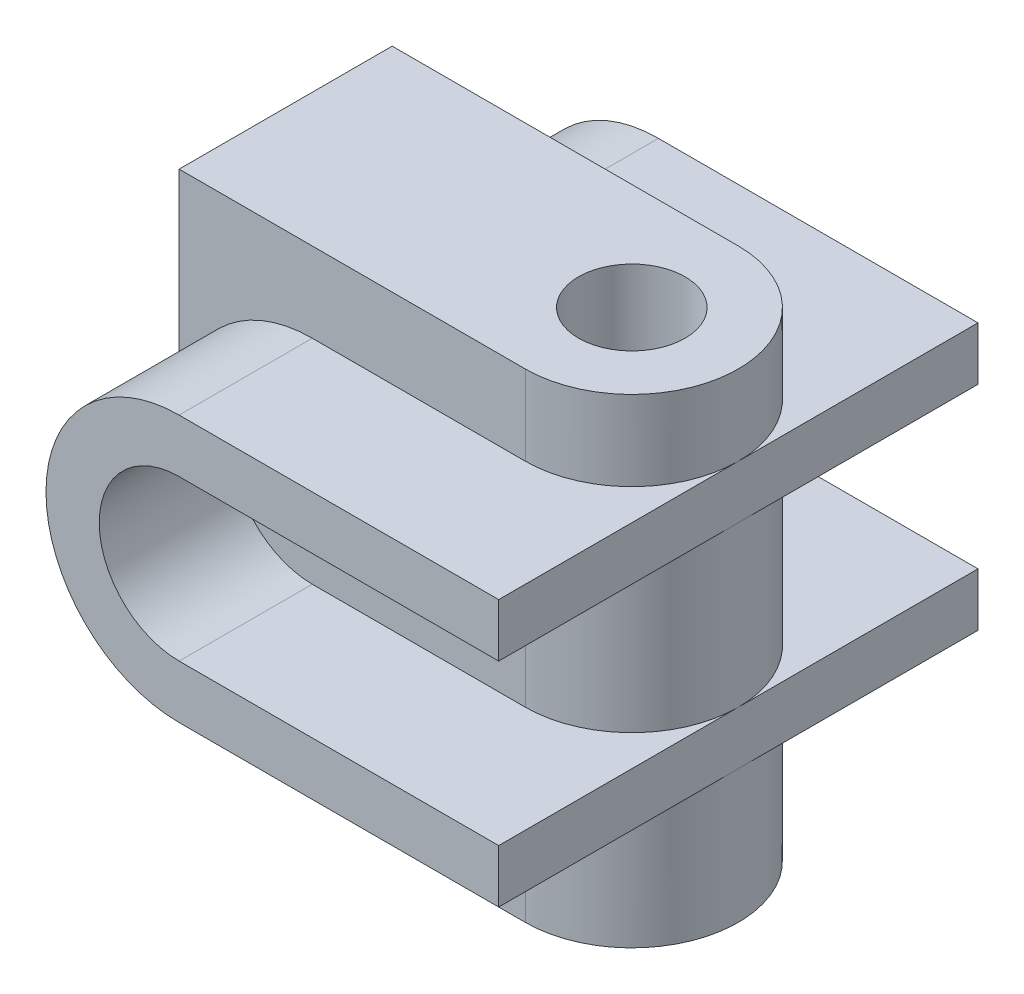
ISO-10303-21;
HEADER;
FILE_DESCRIPTION(('STEP AP214'),'2;1');
FILE_NAME('part.step','',(''),(''),'','','');
FILE_SCHEMA(('AUTOMOTIVE_DESIGN { 1 0 10303 214 1 1 1 1 }'));
ENDSEC;
DATA;
#1=APPLICATION_CONTEXT('core data for automotive mechanical design processes');
#2=APPLICATION_PROTOCOL_DEFINITION('international standard','automotive_design',2000,#1);
#3=PRODUCT_CONTEXT('',#1,'mechanical');
#4=PRODUCT('Part','Part','',(#3));
#5=PRODUCT_RELATED_PRODUCT_CATEGORY('part','',(#4));
#6=PRODUCT_DEFINITION_FORMATION('','',#4);
#7=PRODUCT_DEFINITION_CONTEXT('part definition',#1,'design');
#8=PRODUCT_DEFINITION('design','',#6,#7);
#9=PRODUCT_DEFINITION_SHAPE('','',#8);
#10=(LENGTH_UNIT() NAMED_UNIT(*) SI_UNIT(.MILLI.,.METRE.));
#11=(NAMED_UNIT(*) PLANE_ANGLE_UNIT() SI_UNIT($,.RADIAN.));
#12=(NAMED_UNIT(*) SI_UNIT($,.STERADIAN.) SOLID_ANGLE_UNIT());
#13=UNCERTAINTY_MEASURE_WITH_UNIT(LENGTH_MEASURE(1.E-05),#10,'distance_accuracy_value','');
#14=(GEOMETRIC_REPRESENTATION_CONTEXT(3) GLOBAL_UNCERTAINTY_ASSIGNED_CONTEXT((#13)) GLOBAL_UNIT_ASSIGNED_CONTEXT((#10,
#11,#12)) REPRESENTATION_CONTEXT('',''));
#15=CARTESIAN_POINT('',(0.,0.,0.));
#16=DIRECTION('',(0.,0.,1.));
#17=DIRECTION('',(1.,0.,0.));
#18=AXIS2_PLACEMENT_3D('',#15,#16,#17);
#19=CARTESIAN_POINT('',(-60.,-65.,90.));
#20=DIRECTION('',(0.,1.,0.));
#21=DIRECTION('',(-1.,0.,0.));
#22=AXIS2_PLACEMENT_3D('',#19,#20,#21);
#23=PLANE('',#22);
#24=CARTESIAN_POINT('',(-20.,-65.,45.));
#25=DIRECTION('',(0.,1.,0.));
#26=DIRECTION('',(-1.,0.,0.));
#27=AXIS2_PLACEMENT_3D('',#24,#25,#26);
#28=CIRCLE('',#27,20.);
#29=CARTESIAN_POINT('',(0.,-65.,45.));
#30=VERTEX_POINT('',#29);
#31=CARTESIAN_POINT('',(-20.,-65.,25.));
#32=VERTEX_POINT('',#31);
#33=EDGE_CURVE('E310',#30,#32,#28,.T.);
#34=ORIENTED_EDGE('',*,*,#33,.T.);
#35=DIRECTION('',(-1.,0.,0.));
#36=VECTOR('',#35,1.);
#37=CARTESIAN_POINT('',(-60.,-65.,25.));
#38=LINE('',#37,#36);
#39=CARTESIAN_POINT('',(-60.,-65.,25.));
#40=VERTEX_POINT('',#39);
#41=EDGE_CURVE('E285',#32,#40,#38,.T.);
#42=ORIENTED_EDGE('',*,*,#41,.T.);
#43=DIRECTION('',(0.,0.,-1.));
#44=VECTOR('',#43,1.);
#45=CARTESIAN_POINT('',(-60.,-65.,90.));
#46=LINE('',#45,#44);
#47=CARTESIAN_POINT('',(-60.,-65.,0.));
#48=VERTEX_POINT('',#47);
#49=EDGE_CURVE('E333',#40,#48,#46,.T.);
#50=ORIENTED_EDGE('',*,*,#49,.T.);
#51=DIRECTION('',(1.,0.,0.));
#52=VECTOR('',#51,1.);
#53=CARTESIAN_POINT('',(-60.,-65.,0.));
#54=LINE('',#53,#52);
#55=CARTESIAN_POINT('',(0.,-65.,0.));
#56=VERTEX_POINT('',#55);
#57=EDGE_CURVE('E332',#48,#56,#54,.T.);
#58=ORIENTED_EDGE('',*,*,#57,.T.);
#59=DIRECTION('',(0.,0.,-1.));
#60=VECTOR('',#59,1.);
#61=CARTESIAN_POINT('',(0.,-65.,90.));
#62=LINE('',#61,#60);
#63=EDGE_CURVE('E385',#30,#56,#62,.T.);
#64=ORIENTED_EDGE('',*,*,#63,.F.);
#65=EDGE_LOOP('',(#34,#42,#50,#58,#64));
#66=FACE_BOUND('',#65,.T.);
#67=ADVANCED_FACE('F55',(#66),#23,.F.);
#68=CARTESIAN_POINT('',(-60.,-55.,90.));
#69=DIRECTION('',(0.,1.,0.));
#70=DIRECTION('',(-1.,0.,0.));
#71=AXIS2_PLACEMENT_3D('',#68,#69,#70);
#72=PLANE('',#71);
#73=DIRECTION('',(-1.,0.,0.));
#74=VECTOR('',#73,1.);
#75=CARTESIAN_POINT('',(-60.,-55.,25.));
#76=LINE('',#75,#74);
#77=CARTESIAN_POINT('',(-20.,-55.,25.));
#78=VERTEX_POINT('',#77);
#79=CARTESIAN_POINT('',(-60.,-55.,25.0000000000001));
#80=VERTEX_POINT('',#79);
#81=EDGE_CURVE('E70',#78,#80,#76,.T.);
#82=ORIENTED_EDGE('',*,*,#81,.F.);
#83=CARTESIAN_POINT('',(-20.,-55.,45.));
#84=DIRECTION('',(0.,1.,0.));
#85=DIRECTION('',(-1.,0.,0.));
#86=AXIS2_PLACEMENT_3D('',#83,#84,#85);
#87=CIRCLE('',#86,20.);
#88=CARTESIAN_POINT('',(0.,-55.,45.));
#89=VERTEX_POINT('',#88);
#90=EDGE_CURVE('E304',#89,#78,#87,.T.);
#91=ORIENTED_EDGE('',*,*,#90,.F.);
#92=DIRECTION('',(0.,0.,-1.));
#93=VECTOR('',#92,1.);
#94=CARTESIAN_POINT('',(0.,-55.,90.));
#95=LINE('',#94,#93);
#96=CARTESIAN_POINT('',(0.,-55.,0.));
#97=VERTEX_POINT('',#96);
#98=EDGE_CURVE('E378',#89,#97,#95,.T.);
#99=ORIENTED_EDGE('',*,*,#98,.T.);
#100=DIRECTION('',(1.,0.,0.));
#101=VECTOR('',#100,1.);
#102=CARTESIAN_POINT('',(-60.,-55.,0.));
#103=LINE('',#102,#101);
#104=CARTESIAN_POINT('',(-60.,-55.,0.));
#105=VERTEX_POINT('',#104);
#106=EDGE_CURVE('E338',#105,#97,#103,.T.);
#107=ORIENTED_EDGE('',*,*,#106,.F.);
#108=DIRECTION('',(0.,0.,-1.));
#109=VECTOR('',#108,1.);
#110=CARTESIAN_POINT('',(-60.,-55.,90.));
#111=LINE('',#110,#109);
#112=EDGE_CURVE('E374',#80,#105,#111,.T.);
#113=ORIENTED_EDGE('',*,*,#112,.F.);
#114=EDGE_LOOP('',(#82,#91,#99,#107,#113));
#115=FACE_BOUND('',#114,.T.);
#116=ADVANCED_FACE('F459',(#115),#72,.T.);
#117=CARTESIAN_POINT('',(-60.,-40.,90.));
#118=DIRECTION('',(0.,0.,-1.));
#119=DIRECTION('',(-1.,0.,0.));
#120=AXIS2_PLACEMENT_3D('',#117,#118,#119);
#121=CYLINDRICAL_SURFACE('',#120,15.);
#122=CARTESIAN_POINT('',(-60.,-40.,25.));
#123=DIRECTION('',(0.,0.,-1.));
#124=DIRECTION('',(-1.,0.,0.));
#125=AXIS2_PLACEMENT_3D('',#122,#123,#124);
#126=CIRCLE('',#125,15.);
#127=CARTESIAN_POINT('',(-60.,-25.,25.0000000000001));
#128=VERTEX_POINT('',#127);
#129=EDGE_CURVE('E293',#80,#128,#126,.T.);
#130=ORIENTED_EDGE('',*,*,#129,.F.);
#131=ORIENTED_EDGE('',*,*,#112,.T.);
#132=CARTESIAN_POINT('',(-60.,-40.,0.));
#133=DIRECTION('',(0.,0.,1.));
#134=DIRECTION('',(1.,0.,0.));
#135=AXIS2_PLACEMENT_3D('',#132,#133,#134);
#136=CIRCLE('',#135,15.);
#137=CARTESIAN_POINT('',(-60.,-25.,0.));
#138=VERTEX_POINT('',#137);
#139=EDGE_CURVE('E344',#138,#105,#136,.T.);
#140=ORIENTED_EDGE('',*,*,#139,.F.);
#141=DIRECTION('',(0.,0.,-1.));
#142=VECTOR('',#141,1.);
#143=CARTESIAN_POINT('',(-60.,-25.,90.));
#144=LINE('',#143,#142);
#145=EDGE_CURVE('E375',#128,#138,#144,.T.);
#146=ORIENTED_EDGE('',*,*,#145,.F.);
#147=EDGE_LOOP('',(#130,#131,#140,#146));
#148=FACE_BOUND('',#147,.T.);
#149=ADVANCED_FACE('F481',(#148),#121,.F.);
#150=CARTESIAN_POINT('',(0.,-25.,90.));
#151=DIRECTION('',(0.,-1.,0.));
#152=DIRECTION('',(1.,0.,0.));
#153=AXIS2_PLACEMENT_3D('',#150,#151,#152);
#154=PLANE('',#153);
#155=DIRECTION('',(1.,0.,0.));
#156=VECTOR('',#155,1.);
#157=CARTESIAN_POINT('',(0.,-25.,25.));
#158=LINE('',#157,#156);
#159=CARTESIAN_POINT('',(-20.,-25.,25.));
#160=VERTEX_POINT('',#159);
#161=EDGE_CURVE('E288',#128,#160,#158,.T.);
#162=ORIENTED_EDGE('',*,*,#161,.F.);
#163=ORIENTED_EDGE('',*,*,#145,.T.);
#164=DIRECTION('',(-1.,0.,0.));
#165=VECTOR('',#164,1.);
#166=CARTESIAN_POINT('',(0.,-25.,0.));
#167=LINE('',#166,#165);
#168=CARTESIAN_POINT('',(0.,-25.,0.));
#169=VERTEX_POINT('',#168);
#170=EDGE_CURVE('E346',#169,#138,#167,.T.);
#171=ORIENTED_EDGE('',*,*,#170,.F.);
#172=DIRECTION('',(0.,0.,-1.));
#173=VECTOR('',#172,1.);
#174=CARTESIAN_POINT('',(0.,-25.,90.));
#175=LINE('',#174,#173);
#176=CARTESIAN_POINT('',(0.,-25.,45.));
#177=VERTEX_POINT('',#176);
#178=EDGE_CURVE('E368',#177,#169,#175,.T.);
#179=ORIENTED_EDGE('',*,*,#178,.F.);
#180=CARTESIAN_POINT('',(-20.,-25.,45.));
#181=DIRECTION('',(0.,-1.,0.));
#182=DIRECTION('',(1.,0.,0.));
#183=AXIS2_PLACEMENT_3D('',#180,#181,#182);
#184=CIRCLE('',#183,20.);
#185=EDGE_CURVE('E302',#160,#177,#184,.T.);
#186=ORIENTED_EDGE('',*,*,#185,.F.);
#187=EDGE_LOOP('',(#162,#163,#171,#179,#186));
#188=FACE_BOUND('',#187,.T.);
#189=ADVANCED_FACE('F442',(#188),#154,.T.);
#190=CARTESIAN_POINT('',(0.,-15.,90.));
#191=DIRECTION('',(0.,-1.,0.));
#192=DIRECTION('',(1.,0.,0.));
#193=AXIS2_PLACEMENT_3D('',#190,#191,#192);
#194=PLANE('',#193);
#195=DIRECTION('',(0.,0.,-1.));
#196=VECTOR('',#195,1.);
#197=CARTESIAN_POINT('',(-60.,-15.,90.));
#198=LINE('',#197,#196);
#199=CARTESIAN_POINT('',(-60.,-15.,25.));
#200=VERTEX_POINT('',#199);
#201=CARTESIAN_POINT('',(-60.,-15.,0.));
#202=VERTEX_POINT('',#201);
#203=EDGE_CURVE('E359',#200,#202,#198,.T.);
#204=ORIENTED_EDGE('',*,*,#203,.F.);
#205=DIRECTION('',(1.,0.,0.));
#206=VECTOR('',#205,1.);
#207=CARTESIAN_POINT('',(0.,-15.,25.));
#208=LINE('',#207,#206);
#209=CARTESIAN_POINT('',(-20.,-15.,25.));
#210=VERTEX_POINT('',#209);
#211=EDGE_CURVE('E282',#200,#210,#208,.T.);
#212=ORIENTED_EDGE('',*,*,#211,.T.);
#213=CARTESIAN_POINT('',(-20.,-15.,45.));
#214=DIRECTION('',(0.,-1.,0.));
#215=DIRECTION('',(1.,0.,0.));
#216=AXIS2_PLACEMENT_3D('',#213,#214,#215);
#217=CIRCLE('',#216,20.);
#218=CARTESIAN_POINT('',(0.,-15.,45.));
#219=VERTEX_POINT('',#218);
#220=EDGE_CURVE('E65',#210,#219,#217,.T.);
#221=ORIENTED_EDGE('',*,*,#220,.T.);
#222=DIRECTION('',(0.,0.,-1.));
#223=VECTOR('',#222,1.);
#224=CARTESIAN_POINT('',(0.,-15.,90.));
#225=LINE('',#224,#223);
#226=CARTESIAN_POINT('',(0.,-15.,0.));
#227=VERTEX_POINT('',#226);
#228=EDGE_CURVE('E364',#219,#227,#225,.T.);
#229=ORIENTED_EDGE('',*,*,#228,.T.);
#230=DIRECTION('',(-1.,0.,0.));
#231=VECTOR('',#230,1.);
#232=CARTESIAN_POINT('',(0.,-15.,0.));
#233=LINE('',#232,#231);
#234=EDGE_CURVE('E355',#227,#202,#233,.T.);
#235=ORIENTED_EDGE('',*,*,#234,.T.);
#236=EDGE_LOOP('',(#204,#212,#221,#229,#235));
#237=FACE_BOUND('',#236,.T.);
#238=ADVANCED_FACE('F487',(#237),#194,.F.);
#239=CARTESIAN_POINT('',(-60.,-40.,90.));
#240=DIRECTION('',(0.,0.,-1.));
#241=DIRECTION('',(-1.,0.,0.));
#242=AXIS2_PLACEMENT_3D('',#239,#240,#241);
#243=CYLINDRICAL_SURFACE('',#242,25.);
#244=CARTESIAN_POINT('',(-60.,-40.,65.));
#245=DIRECTION('',(0.,0.,1.));
#246=DIRECTION('',(1.,0.,0.));
#247=AXIS2_PLACEMENT_3D('',#244,#245,#246);
#248=CIRCLE('',#247,25.);
#249=CARTESIAN_POINT('',(-60.,-15.,65.));
#250=VERTEX_POINT('',#249);
#251=CARTESIAN_POINT('',(-85.,-40.,65.));
#252=VERTEX_POINT('',#251);
#253=EDGE_CURVE('E387',#250,#252,#248,.T.);
#254=ORIENTED_EDGE('',*,*,#253,.T.);
#255=CARTESIAN_POINT('',(-60.,-65.,65.));
#256=VERTEX_POINT('',#255);
#257=EDGE_CURVE('E388',#252,#256,#248,.T.);
#258=ORIENTED_EDGE('',*,*,#257,.T.);
#259=CARTESIAN_POINT('',(-60.,-65.,90.));
#260=VERTEX_POINT('',#259);
#261=EDGE_CURVE('E357',#260,#256,#46,.T.);
#262=ORIENTED_EDGE('',*,*,#261,.F.);
#263=CARTESIAN_POINT('',(-60.,-40.,90.));
#264=DIRECTION('',(0.,0.,1.));
#265=DIRECTION('',(1.,0.,0.));
#266=AXIS2_PLACEMENT_3D('',#263,#264,#265);
#267=CIRCLE('',#266,25.);
#268=CARTESIAN_POINT('',(-60.,-15.,90.));
#269=VERTEX_POINT('',#268);
#270=EDGE_CURVE('E331',#269,#260,#267,.T.);
#271=ORIENTED_EDGE('',*,*,#270,.F.);
#272=EDGE_CURVE('E363',#269,#250,#198,.T.);
#273=ORIENTED_EDGE('',*,*,#272,.T.);
#274=EDGE_LOOP('',(#254,#258,#262,#271,#273));
#275=FACE_BOUND('',#274,.T.);
#276=ADVANCED_FACE('F404',(#275),#243,.T.);
#277=DIRECTION('',(1.,0.,0.));
#278=VECTOR('',#277,1.);
#279=CARTESIAN_POINT('',(-60.,-65.,65.));
#280=LINE('',#279,#278);
#281=CARTESIAN_POINT('',(-20.,-65.,65.));
#282=VERTEX_POINT('',#281);
#283=EDGE_CURVE('E272',#256,#282,#280,.T.);
#284=ORIENTED_EDGE('',*,*,#283,.T.);
#285=EDGE_CURVE('E309',#282,#30,#28,.T.);
#286=ORIENTED_EDGE('',*,*,#285,.T.);
#287=CARTESIAN_POINT('',(0.,-65.,90.));
#288=VERTEX_POINT('',#287);
#289=EDGE_CURVE('E384',#288,#30,#62,.T.);
#290=ORIENTED_EDGE('',*,*,#289,.F.);
#291=DIRECTION('',(1.,0.,0.));
#292=VECTOR('',#291,1.);
#293=CARTESIAN_POINT('',(-60.,-65.,90.));
#294=LINE('',#293,#292);
#295=EDGE_CURVE('E311',#260,#288,#294,.T.);
#296=ORIENTED_EDGE('',*,*,#295,.F.);
#297=ORIENTED_EDGE('',*,*,#261,.T.);
#298=EDGE_LOOP('',(#284,#286,#290,#296,#297));
#299=FACE_BOUND('',#298,.T.);
#300=ADVANCED_FACE('F53',(#299),#23,.F.);
#301=CARTESIAN_POINT('',(0.,-55.,90.));
#302=DIRECTION('',(1.,0.,0.));
#303=DIRECTION('',(0.,1.,0.));
#304=AXIS2_PLACEMENT_3D('',#301,#302,#303);
#305=PLANE('',#304);
#306=ORIENTED_EDGE('',*,*,#98,.F.);
#307=CARTESIAN_POINT('',(0.,-55.,90.));
#308=VERTEX_POINT('',#307);
#309=EDGE_CURVE('E379',#308,#89,#95,.T.);
#310=ORIENTED_EDGE('',*,*,#309,.F.);
#311=DIRECTION('',(0.,-1.,0.));
#312=VECTOR('',#311,1.);
#313=CARTESIAN_POINT('',(0.,-55.,90.));
#314=LINE('',#313,#312);
#315=EDGE_CURVE('E312',#308,#288,#314,.T.);
#316=ORIENTED_EDGE('',*,*,#315,.T.);
#317=ORIENTED_EDGE('',*,*,#289,.T.);
#318=ORIENTED_EDGE('',*,*,#63,.T.);
#319=DIRECTION('',(0.,-1.,0.));
#320=VECTOR('',#319,1.);
#321=CARTESIAN_POINT('',(0.,-55.,0.));
#322=LINE('',#321,#320);
#323=EDGE_CURVE('E340',#97,#56,#322,.T.);
#324=ORIENTED_EDGE('',*,*,#323,.F.);
#325=EDGE_LOOP('',(#306,#310,#316,#317,#318,#324));
#326=FACE_BOUND('',#325,.T.);
#327=ADVANCED_FACE('F453',(#326),#305,.T.);
#328=CARTESIAN_POINT('',(-20.,-55.,65.));
#329=VERTEX_POINT('',#328);
#330=EDGE_CURVE('E76',#329,#89,#87,.T.);
#331=ORIENTED_EDGE('',*,*,#330,.F.);
#332=DIRECTION('',(1.,0.,0.));
#333=VECTOR('',#332,1.);
#334=CARTESIAN_POINT('',(-60.,-55.,65.));
#335=LINE('',#334,#333);
#336=CARTESIAN_POINT('',(-60.,-55.,65.));
#337=VERTEX_POINT('',#336);
#338=EDGE_CURVE('E278',#337,#329,#335,.T.);
#339=ORIENTED_EDGE('',*,*,#338,.F.);
#340=CARTESIAN_POINT('',(-60.,-55.,90.));
#341=VERTEX_POINT('',#340);
#342=EDGE_CURVE('E376',#341,#337,#111,.T.);
#343=ORIENTED_EDGE('',*,*,#342,.F.);
#344=DIRECTION('',(1.,0.,0.));
#345=VECTOR('',#344,1.);
#346=CARTESIAN_POINT('',(-60.,-55.,90.));
#347=LINE('',#346,#345);
#348=EDGE_CURVE('E320',#341,#308,#347,.T.);
#349=ORIENTED_EDGE('',*,*,#348,.T.);
#350=ORIENTED_EDGE('',*,*,#309,.T.);
#351=EDGE_LOOP('',(#331,#339,#343,#349,#350));
#352=FACE_BOUND('',#351,.T.);
#353=ADVANCED_FACE('F455',(#352),#72,.T.);
#354=CARTESIAN_POINT('',(-60.,-40.,65.));
#355=DIRECTION('',(0.,0.,1.));
#356=DIRECTION('',(1.,0.,0.));
#357=AXIS2_PLACEMENT_3D('',#354,#355,#356);
#358=CIRCLE('',#357,15.);
#359=CARTESIAN_POINT('',(-60.,-25.,65.));
#360=VERTEX_POINT('',#359);
#361=EDGE_CURVE('E280',#360,#337,#358,.T.);
#362=ORIENTED_EDGE('',*,*,#361,.F.);
#363=CARTESIAN_POINT('',(-60.,-25.,90.));
#364=VERTEX_POINT('',#363);
#365=EDGE_CURVE('E373',#364,#360,#144,.T.);
#366=ORIENTED_EDGE('',*,*,#365,.F.);
#367=CARTESIAN_POINT('',(-60.,-40.,90.));
#368=DIRECTION('',(0.,0.,1.));
#369=DIRECTION('',(1.,0.,0.));
#370=AXIS2_PLACEMENT_3D('',#367,#368,#369);
#371=CIRCLE('',#370,15.);
#372=EDGE_CURVE('E318',#364,#341,#371,.T.);
#373=ORIENTED_EDGE('',*,*,#372,.T.);
#374=ORIENTED_EDGE('',*,*,#342,.T.);
#375=EDGE_LOOP('',(#362,#366,#373,#374));
#376=FACE_BOUND('',#375,.T.);
#377=ADVANCED_FACE('F452',(#376),#121,.F.);
#378=CARTESIAN_POINT('',(-20.,-25.,65.));
#379=VERTEX_POINT('',#378);
#380=EDGE_CURVE('E297',#177,#379,#184,.T.);
#381=ORIENTED_EDGE('',*,*,#380,.F.);
#382=CARTESIAN_POINT('',(0.,-25.,90.));
#383=VERTEX_POINT('',#382);
#384=EDGE_CURVE('E367',#383,#177,#175,.T.);
#385=ORIENTED_EDGE('',*,*,#384,.F.);
#386=DIRECTION('',(-1.,0.,0.));
#387=VECTOR('',#386,1.);
#388=CARTESIAN_POINT('',(0.,-25.,90.));
#389=LINE('',#388,#387);
#390=EDGE_CURVE('E324',#383,#364,#389,.T.);
#391=ORIENTED_EDGE('',*,*,#390,.T.);
#392=ORIENTED_EDGE('',*,*,#365,.T.);
#393=DIRECTION('',(-1.,0.,0.));
#394=VECTOR('',#393,1.);
#395=CARTESIAN_POINT('',(0.,-25.,65.));
#396=LINE('',#395,#394);
#397=EDGE_CURVE('E274',#379,#360,#396,.T.);
#398=ORIENTED_EDGE('',*,*,#397,.F.);
#399=EDGE_LOOP('',(#381,#385,#391,#392,#398));
#400=FACE_BOUND('',#399,.T.);
#401=ADVANCED_FACE('F437',(#400),#154,.T.);
#402=CARTESIAN_POINT('',(0.,-15.,90.));
#403=DIRECTION('',(1.,0.,0.));
#404=DIRECTION('',(0.,1.,0.));
#405=AXIS2_PLACEMENT_3D('',#402,#403,#404);
#406=PLANE('',#405);
#407=ORIENTED_EDGE('',*,*,#228,.F.);
#408=CARTESIAN_POINT('',(0.,-15.,90.));
#409=VERTEX_POINT('',#408);
#410=EDGE_CURVE('E362',#409,#219,#225,.T.);
#411=ORIENTED_EDGE('',*,*,#410,.F.);
#412=DIRECTION('',(0.,-1.,0.));
#413=VECTOR('',#412,1.);
#414=CARTESIAN_POINT('',(0.,-15.,90.));
#415=LINE('',#414,#413);
#416=EDGE_CURVE('E326',#409,#383,#415,.T.);
#417=ORIENTED_EDGE('',*,*,#416,.T.);
#418=ORIENTED_EDGE('',*,*,#384,.T.);
#419=ORIENTED_EDGE('',*,*,#178,.T.);
#420=DIRECTION('',(0.,-1.,0.));
#421=VECTOR('',#420,1.);
#422=CARTESIAN_POINT('',(0.,-15.,0.));
#423=LINE('',#422,#421);
#424=EDGE_CURVE('E348',#227,#169,#423,.T.);
#425=ORIENTED_EDGE('',*,*,#424,.F.);
#426=EDGE_LOOP('',(#407,#411,#417,#418,#419,#425));
#427=FACE_BOUND('',#426,.T.);
#428=ADVANCED_FACE('F450',(#427),#406,.T.);
#429=ORIENTED_EDGE('',*,*,#410,.T.);
#430=CARTESIAN_POINT('',(-20.,-15.,65.));
#431=VERTEX_POINT('',#430);
#432=EDGE_CURVE('E57',#219,#431,#217,.T.);
#433=ORIENTED_EDGE('',*,*,#432,.T.);
#434=DIRECTION('',(-1.,0.,0.));
#435=VECTOR('',#434,1.);
#436=CARTESIAN_POINT('',(0.,-15.,65.));
#437=LINE('',#436,#435);
#438=EDGE_CURVE('E256',#431,#250,#437,.T.);
#439=ORIENTED_EDGE('',*,*,#438,.T.);
#440=ORIENTED_EDGE('',*,*,#272,.F.);
#441=DIRECTION('',(-1.,0.,0.));
#442=VECTOR('',#441,1.);
#443=CARTESIAN_POINT('',(0.,-15.,90.));
#444=LINE('',#443,#442);
#445=EDGE_CURVE('E328',#409,#269,#444,.T.);
#446=ORIENTED_EDGE('',*,*,#445,.F.);
#447=EDGE_LOOP('',(#429,#433,#439,#440,#446));
#448=FACE_BOUND('',#447,.T.);
#449=ADVANCED_FACE('F417',(#448),#194,.F.);
#450=CARTESIAN_POINT('',(-60.,-40.,25.));
#451=DIRECTION('',(0.,0.,-1.));
#452=DIRECTION('',(-1.,0.,0.));
#453=AXIS2_PLACEMENT_3D('',#450,#451,#452);
#454=CIRCLE('',#453,25.);
#455=CARTESIAN_POINT('',(-85.,-40.,25.));
#456=VERTEX_POINT('',#455);
#457=EDGE_CURVE('E386',#40,#456,#454,.T.);
#458=ORIENTED_EDGE('',*,*,#457,.T.);
#459=EDGE_CURVE('E391',#456,#200,#454,.T.);
#460=ORIENTED_EDGE('',*,*,#459,.T.);
#461=ORIENTED_EDGE('',*,*,#203,.T.);
#462=CARTESIAN_POINT('',(-60.,-40.,0.));
#463=DIRECTION('',(0.,0.,1.));
#464=DIRECTION('',(1.,0.,0.));
#465=AXIS2_PLACEMENT_3D('',#462,#463,#464);
#466=CIRCLE('',#465,25.);
#467=EDGE_CURVE('E313',#202,#48,#466,.T.);
#468=ORIENTED_EDGE('',*,*,#467,.T.);
#469=ORIENTED_EDGE('',*,*,#49,.F.);
#470=EDGE_LOOP('',(#458,#460,#461,#468,#469));
#471=FACE_BOUND('',#470,.T.);
#472=ADVANCED_FACE('F503',(#471),#243,.T.);
#473=CARTESIAN_POINT('',(-60.,-40.,90.));
#474=DIRECTION('',(0.,0.,1.));
#475=DIRECTION('',(1.,0.,0.));
#476=AXIS2_PLACEMENT_3D('',#473,#474,#475);
#477=PLANE('',#476);
#478=ORIENTED_EDGE('',*,*,#295,.T.);
#479=ORIENTED_EDGE('',*,*,#315,.F.);
#480=ORIENTED_EDGE('',*,*,#348,.F.);
#481=ORIENTED_EDGE('',*,*,#372,.F.);
#482=ORIENTED_EDGE('',*,*,#390,.F.);
#483=ORIENTED_EDGE('',*,*,#416,.F.);
#484=ORIENTED_EDGE('',*,*,#445,.T.);
#485=ORIENTED_EDGE('',*,*,#270,.T.);
#486=EDGE_LOOP('',(#478,#479,#480,#481,#482,#483,#484,#485));
#487=FACE_BOUND('',#486,.T.);
#488=ADVANCED_FACE('F414',(#487),#477,.T.);
#489=CARTESIAN_POINT('',(-60.,-40.,0.));
#490=DIRECTION('',(0.,0.,1.));
#491=DIRECTION('',(1.,0.,0.));
#492=AXIS2_PLACEMENT_3D('',#489,#490,#491);
#493=PLANE('',#492);
#494=ORIENTED_EDGE('',*,*,#57,.F.);
#495=ORIENTED_EDGE('',*,*,#467,.F.);
#496=ORIENTED_EDGE('',*,*,#234,.F.);
#497=ORIENTED_EDGE('',*,*,#424,.T.);
#498=ORIENTED_EDGE('',*,*,#170,.T.);
#499=ORIENTED_EDGE('',*,*,#139,.T.);
#500=ORIENTED_EDGE('',*,*,#106,.T.);
#501=ORIENTED_EDGE('',*,*,#323,.T.);
#502=EDGE_LOOP('',(#494,#495,#496,#497,#498,#499,#500,#501));
#503=FACE_BOUND('',#502,.T.);
#504=ADVANCED_FACE('F477',(#503),#493,.F.);
#505=CARTESIAN_POINT('',(-20.,0.,45.));
#506=DIRECTION('',(0.,1.,0.));
#507=DIRECTION('',(0.,0.,1.));
#508=AXIS2_PLACEMENT_3D('',#505,#506,#507);
#509=PLANE('',#508);
#510=CARTESIAN_POINT('',(-20.,0.,45.));
#511=DIRECTION('',(0.,1.,0.));
#512=DIRECTION('',(0.,0.,1.));
#513=AXIS2_PLACEMENT_3D('',#510,#511,#512);
#514=CIRCLE('',#513,10.);
#515=CARTESIAN_POINT('',(-20.,0.,55.));
#516=VERTEX_POINT('',#515);
#517=EDGE_CURVE('E243',#516,#516,#514,.T.);
#518=ORIENTED_EDGE('',*,*,#517,.F.);
#519=EDGE_LOOP('',(#518));
#520=FACE_BOUND('',#519,.T.);
#521=DIRECTION('',(-1.,0.,0.));
#522=VECTOR('',#521,1.);
#523=CARTESIAN_POINT('',(-20.,0.,25.));
#524=LINE('',#523,#522);
#525=CARTESIAN_POINT('',(-20.,0.,25.));
#526=VERTEX_POINT('',#525);
#527=CARTESIAN_POINT('',(-85.,0.,25.));
#528=VERTEX_POINT('',#527);
#529=EDGE_CURVE('E248',#526,#528,#524,.T.);
#530=ORIENTED_EDGE('',*,*,#529,.T.);
#531=DIRECTION('',(0.,0.,1.));
#532=VECTOR('',#531,1.);
#533=CARTESIAN_POINT('',(-85.,0.,25.));
#534=LINE('',#533,#532);
#535=CARTESIAN_POINT('',(-85.,0.,65.));
#536=VERTEX_POINT('',#535);
#537=EDGE_CURVE('E255',#528,#536,#534,.T.);
#538=ORIENTED_EDGE('',*,*,#537,.T.);
#539=DIRECTION('',(1.,0.,0.));
#540=VECTOR('',#539,1.);
#541=CARTESIAN_POINT('',(-85.,0.,65.));
#542=LINE('',#541,#540);
#543=CARTESIAN_POINT('',(-20.,0.,65.));
#544=VERTEX_POINT('',#543);
#545=EDGE_CURVE('E239',#536,#544,#542,.T.);
#546=ORIENTED_EDGE('',*,*,#545,.T.);
#547=CARTESIAN_POINT('',(-20.,0.,45.));
#548=DIRECTION('',(0.,1.,0.));
#549=DIRECTION('',(0.,0.,1.));
#550=AXIS2_PLACEMENT_3D('',#547,#548,#549);
#551=CIRCLE('',#550,20.);
#552=EDGE_CURVE('E240',#544,#526,#551,.T.);
#553=ORIENTED_EDGE('',*,*,#552,.T.);
#554=EDGE_LOOP('',(#530,#538,#546,#553));
#555=FACE_BOUND('',#554,.T.);
#556=ADVANCED_FACE('F470',(#520,#555),#509,.T.);
#557=CARTESIAN_POINT('',(-20.,-90.,45.));
#558=DIRECTION('',(0.,1.,0.));
#559=DIRECTION('',(0.,0.,1.));
#560=AXIS2_PLACEMENT_3D('',#557,#558,#559);
#561=PLANE('',#560);
#562=CARTESIAN_POINT('',(-20.,-90.,45.));
#563=DIRECTION('',(0.,1.,0.));
#564=DIRECTION('',(0.,0.,1.));
#565=AXIS2_PLACEMENT_3D('',#562,#563,#564);
#566=CIRCLE('',#565,10.);
#567=CARTESIAN_POINT('',(-20.,-90.,55.));
#568=VERTEX_POINT('',#567);
#569=EDGE_CURVE('E254',#568,#568,#566,.T.);
#570=ORIENTED_EDGE('',*,*,#569,.T.);
#571=EDGE_LOOP('',(#570));
#572=FACE_BOUND('',#571,.T.);
#573=DIRECTION('',(-1.,0.,0.));
#574=VECTOR('',#573,1.);
#575=CARTESIAN_POINT('',(-20.,-90.,25.));
#576=LINE('',#575,#574);
#577=CARTESIAN_POINT('',(-20.,-90.,25.));
#578=VERTEX_POINT('',#577);
#579=CARTESIAN_POINT('',(-85.,-90.,25.));
#580=VERTEX_POINT('',#579);
#581=EDGE_CURVE('E230',#578,#580,#576,.T.);
#582=ORIENTED_EDGE('',*,*,#581,.F.);
#583=CARTESIAN_POINT('',(-20.,-90.,45.));
#584=DIRECTION('',(0.,1.,0.));
#585=DIRECTION('',(0.,0.,1.));
#586=AXIS2_PLACEMENT_3D('',#583,#584,#585);
#587=CIRCLE('',#586,20.);
#588=CARTESIAN_POINT('',(-20.,-90.,65.));
#589=VERTEX_POINT('',#588);
#590=EDGE_CURVE('E250',#589,#578,#587,.T.);
#591=ORIENTED_EDGE('',*,*,#590,.F.);
#592=DIRECTION('',(1.,0.,0.));
#593=VECTOR('',#592,1.);
#594=CARTESIAN_POINT('',(-85.,-90.,65.));
#595=LINE('',#594,#593);
#596=CARTESIAN_POINT('',(-85.,-90.,65.));
#597=VERTEX_POINT('',#596);
#598=EDGE_CURVE('E235',#597,#589,#595,.T.);
#599=ORIENTED_EDGE('',*,*,#598,.F.);
#600=DIRECTION('',(0.,0.,1.));
#601=VECTOR('',#600,1.);
#602=CARTESIAN_POINT('',(-85.,-90.,25.));
#603=LINE('',#602,#601);
#604=EDGE_CURVE('E216',#580,#597,#603,.T.);
#605=ORIENTED_EDGE('',*,*,#604,.F.);
#606=EDGE_LOOP('',(#582,#591,#599,#605));
#607=FACE_BOUND('',#606,.T.);
#608=ADVANCED_FACE('F227',(#572,#607),#561,.F.);
#609=CARTESIAN_POINT('',(-85.,-90.,65.));
#610=DIRECTION('',(0.,0.,1.));
#611=DIRECTION('',(1.,0.,0.));
#612=AXIS2_PLACEMENT_3D('',#609,#610,#611);
#613=PLANE('',#612);
#614=ORIENTED_EDGE('',*,*,#438,.F.);
#615=DIRECTION('',(0.,1.,0.));
#616=VECTOR('',#615,1.);
#617=CARTESIAN_POINT('',(-20.,-90.,65.));
#618=LINE('',#617,#616);
#619=EDGE_CURVE('E266',#431,#544,#618,.T.);
#620=ORIENTED_EDGE('',*,*,#619,.T.);
#621=ORIENTED_EDGE('',*,*,#545,.F.);
#622=DIRECTION('',(0.,1.,0.));
#623=VECTOR('',#622,1.);
#624=CARTESIAN_POINT('',(-85.,-90.,65.));
#625=LINE('',#624,#623);
#626=EDGE_CURVE('E225',#252,#536,#625,.T.);
#627=ORIENTED_EDGE('',*,*,#626,.F.);
#628=ORIENTED_EDGE('',*,*,#253,.F.);
#629=EDGE_LOOP('',(#614,#620,#621,#627,#628));
#630=FACE_BOUND('',#629,.T.);
#631=ADVANCED_FACE('F422',(#630),#613,.T.);
#632=CARTESIAN_POINT('',(-20.,-90.,25.));
#633=DIRECTION('',(0.,0.,-1.));
#634=DIRECTION('',(-1.,0.,0.));
#635=AXIS2_PLACEMENT_3D('',#632,#633,#634);
#636=PLANE('',#635);
#637=ORIENTED_EDGE('',*,*,#211,.F.);
#638=ORIENTED_EDGE('',*,*,#459,.F.);
#639=DIRECTION('',(0.,1.,0.));
#640=VECTOR('',#639,1.);
#641=CARTESIAN_POINT('',(-85.,-90.,25.));
#642=LINE('',#641,#640);
#643=EDGE_CURVE('E219',#456,#528,#642,.T.);
#644=ORIENTED_EDGE('',*,*,#643,.T.);
#645=ORIENTED_EDGE('',*,*,#529,.F.);
#646=DIRECTION('',(0.,1.,0.));
#647=VECTOR('',#646,1.);
#648=CARTESIAN_POINT('',(-20.,-90.,25.));
#649=LINE('',#648,#647);
#650=EDGE_CURVE('E261',#210,#526,#649,.T.);
#651=ORIENTED_EDGE('',*,*,#650,.F.);
#652=EDGE_LOOP('',(#637,#638,#644,#645,#651));
#653=FACE_BOUND('',#652,.T.);
#654=ADVANCED_FACE('F464',(#653),#636,.T.);
#655=CARTESIAN_POINT('',(-85.,-90.,25.));
#656=DIRECTION('',(-1.,0.,0.));
#657=DIRECTION('',(0.,0.,1.));
#658=AXIS2_PLACEMENT_3D('',#655,#656,#657);
#659=PLANE('',#658);
#660=ORIENTED_EDGE('',*,*,#643,.F.);
#661=EDGE_CURVE('E214',#580,#456,#642,.T.);
#662=ORIENTED_EDGE('',*,*,#661,.F.);
#663=ORIENTED_EDGE('',*,*,#604,.T.);
#664=EDGE_CURVE('E270',#597,#252,#625,.T.);
#665=ORIENTED_EDGE('',*,*,#664,.T.);
#666=ORIENTED_EDGE('',*,*,#626,.T.);
#667=ORIENTED_EDGE('',*,*,#537,.F.);
#668=EDGE_LOOP('',(#660,#662,#663,#665,#666,#667));
#669=FACE_BOUND('',#668,.T.);
#670=ADVANCED_FACE('F213',(#669),#659,.T.);
#671=ORIENTED_EDGE('',*,*,#283,.F.);
#672=ORIENTED_EDGE('',*,*,#257,.F.);
#673=ORIENTED_EDGE('',*,*,#664,.F.);
#674=ORIENTED_EDGE('',*,*,#598,.T.);
#675=EDGE_CURVE('E262',#589,#282,#618,.T.);
#676=ORIENTED_EDGE('',*,*,#675,.T.);
#677=EDGE_LOOP('',(#671,#672,#673,#674,#676));
#678=FACE_BOUND('',#677,.T.);
#679=ADVANCED_FACE('F466',(#678),#613,.T.);
#680=ORIENTED_EDGE('',*,*,#41,.F.);
#681=EDGE_CURVE('E236',#578,#32,#649,.T.);
#682=ORIENTED_EDGE('',*,*,#681,.F.);
#683=ORIENTED_EDGE('',*,*,#581,.T.);
#684=ORIENTED_EDGE('',*,*,#661,.T.);
#685=ORIENTED_EDGE('',*,*,#457,.F.);
#686=EDGE_LOOP('',(#680,#682,#683,#684,#685));
#687=FACE_BOUND('',#686,.T.);
#688=ADVANCED_FACE('F234',(#687),#636,.T.);
#689=CARTESIAN_POINT('',(-20.,-90.,45.));
#690=DIRECTION('',(0.,1.,0.));
#691=DIRECTION('',(0.,0.,1.));
#692=AXIS2_PLACEMENT_3D('',#689,#690,#691);
#693=CYLINDRICAL_SURFACE('',#692,10.);
#694=CARTESIAN_POINT('',(-20.,-15.,45.));
#695=DIRECTION('',(0.,-1.,0.));
#696=DIRECTION('',(1.,0.,0.));
#697=AXIS2_PLACEMENT_3D('',#694,#695,#696);
#698=CIRCLE('',#697,10.);
#699=CARTESIAN_POINT('',(-20.,-15.,55.));
#700=VERTEX_POINT('',#699);
#701=EDGE_CURVE('E392',#700,#700,#698,.T.);
#702=CARTESIAN_POINT('',(-20.,0.,55.));
#703=CARTESIAN_POINT('',(-20.,-0.156250000000015,55.));
#704=CARTESIAN_POINT('',(-20.,-0.312500000000016,55.));
#705=CARTESIAN_POINT('',(-20.,-0.625000000000014,55.));
#706=CARTESIAN_POINT('',(-20.,-0.781250000000011,55.));
#707=CARTESIAN_POINT('',(-20.,-1.09375000000001,55.));
#708=CARTESIAN_POINT('',(-20.,-1.25000000000001,55.));
#709=CARTESIAN_POINT('',(-20.,-1.56250000000001,55.));
#710=CARTESIAN_POINT('',(-20.,-1.71875000000001,55.));
#711=CARTESIAN_POINT('',(-20.,-2.03125000000001,55.));
#712=CARTESIAN_POINT('',(-20.,-2.18750000000001,55.));
#713=CARTESIAN_POINT('',(-20.,-2.50000000000001,55.));
#714=CARTESIAN_POINT('',(-20.,-2.65625000000001,55.));
#715=CARTESIAN_POINT('',(-20.,-2.96875000000001,55.));
#716=CARTESIAN_POINT('',(-20.,-3.12500000000001,55.));
#717=CARTESIAN_POINT('',(-20.,-3.43750000000001,55.));
#718=CARTESIAN_POINT('',(-20.,-3.59375000000002,55.));
#719=CARTESIAN_POINT('',(-20.,-3.90625000000001,55.));
#720=CARTESIAN_POINT('',(-20.,-4.06250000000001,55.));
#721=CARTESIAN_POINT('',(-20.,-4.37500000000001,55.));
#722=CARTESIAN_POINT('',(-20.,-4.53125000000001,55.));
#723=CARTESIAN_POINT('',(-20.,-4.84375000000001,55.));
#724=CARTESIAN_POINT('',(-20.,-5.00000000000001,55.));
#725=CARTESIAN_POINT('',(-20.,-5.31250000000001,55.));
#726=CARTESIAN_POINT('',(-20.,-5.46875000000001,55.));
#727=CARTESIAN_POINT('',(-20.,-5.78125000000001,55.));
#728=CARTESIAN_POINT('',(-20.,-5.93750000000001,55.));
#729=CARTESIAN_POINT('',(-20.,-6.25000000000001,55.));
#730=CARTESIAN_POINT('',(-20.,-6.40625000000001,55.));
#731=CARTESIAN_POINT('',(-20.,-6.71875000000001,55.));
#732=CARTESIAN_POINT('',(-20.,-6.87500000000001,55.));
#733=CARTESIAN_POINT('',(-20.,-7.1875,55.));
#734=CARTESIAN_POINT('',(-20.,-7.34375000000001,55.));
#735=CARTESIAN_POINT('',(-20.,-7.65625000000001,55.));
#736=CARTESIAN_POINT('',(-20.,-7.81250000000001,55.));
#737=CARTESIAN_POINT('',(-20.,-8.12500000000001,55.));
#738=CARTESIAN_POINT('',(-20.,-8.28125,55.));
#739=CARTESIAN_POINT('',(-20.,-8.59375,55.));
#740=CARTESIAN_POINT('',(-20.,-8.75,55.));
#741=CARTESIAN_POINT('',(-20.,-9.06250000000001,55.));
#742=CARTESIAN_POINT('',(-20.,-9.21875000000001,55.));
#743=CARTESIAN_POINT('',(-20.,-9.53125000000001,55.));
#744=CARTESIAN_POINT('',(-20.,-9.6875,55.));
#745=CARTESIAN_POINT('',(-20.,-10.,55.));
#746=CARTESIAN_POINT('',(-20.,-10.15625,55.));
#747=CARTESIAN_POINT('',(-20.,-10.46875,55.));
#748=CARTESIAN_POINT('',(-20.,-10.625,55.));
#749=CARTESIAN_POINT('',(-20.,-10.9375,55.));
#750=CARTESIAN_POINT('',(-20.,-11.09375,55.));
#751=CARTESIAN_POINT('',(-20.,-11.40625,55.));
#752=CARTESIAN_POINT('',(-20.,-11.5625,55.));
#753=CARTESIAN_POINT('',(-20.,-11.875,55.));
#754=CARTESIAN_POINT('',(-20.,-12.03125,55.));
#755=CARTESIAN_POINT('',(-20.,-12.34375,55.));
#756=CARTESIAN_POINT('',(-20.,-12.5,55.));
#757=CARTESIAN_POINT('',(-20.,-12.8125,55.));
#758=CARTESIAN_POINT('',(-20.,-12.96875,55.));
#759=CARTESIAN_POINT('',(-20.,-13.28125,55.));
#760=CARTESIAN_POINT('',(-20.,-13.4375,55.));
#761=CARTESIAN_POINT('',(-20.,-13.75,55.));
#762=CARTESIAN_POINT('',(-20.,-13.90625,55.));
#763=CARTESIAN_POINT('',(-20.,-14.21875,55.));
#764=CARTESIAN_POINT('',(-20.,-14.375,55.));
#765=CARTESIAN_POINT('',(-20.,-14.6875,55.));
#766=CARTESIAN_POINT('',(-20.,-14.84375,55.));
#767=CARTESIAN_POINT('',(-20.,-15.,55.));
#768=B_SPLINE_CURVE_WITH_KNOTS('',3,(#702,#703,#704,#705,#706,#707,#708,#709,#710,#711,#712,
#713,#714,#715,#716,#717,#718,#719,#720,#721,#722,#723,#724,#725,#726,#727,#728,#729,#730,#731,
#732,#733,#734,#735,#736,#737,#738,#739,#740,#741,#742,#743,#744,#745,#746,#747,#748,#749,#750,
#751,#752,#753,#754,#755,#756,#757,#758,#759,#760,#761,#762,#763,#764,#765,#766,#767),
.UNSPECIFIED.,.F.,.F.,(4,2,2,2,2,2,2,2,2,2,2,2,2,2,2,2,2,2,2,2,2,2,2,2,2,2,2,2,2,2,2,2,4),(0.,
0.468750000000004,0.937499999999994,1.40625,1.875,2.34374999999999,2.8125,3.28125,3.75,
4.21874999999999,4.6875,5.15625,5.62499999999999,6.09374999999999,6.5625,7.03124999999999,
7.49999999999999,7.96875,8.43749999999999,8.90624999999999,9.37499999999999,9.84374999999998,
10.3125,10.78125,11.25,11.71875,12.1875,12.65625,13.125,13.59375,14.0625,14.53125,15.),.UNSPECIFIED.);
#769=EDGE_CURVE('BSEAM559',#516,#700,#768,.T.);
#770=ORIENTED_EDGE('',*,*,#517,.T.);
#771=ORIENTED_EDGE('',*,*,#701,.T.);
#772=ORIENTED_EDGE('',*,*,#769,.T.);
#773=ORIENTED_EDGE('',*,*,#769,.F.);
#774=EDGE_LOOP('',(#770,#772,#771,#773));
#775=FACE_BOUND('',#774,.T.);
#776=ADVANCED_FACE('F559',(#775),#693,.F.);
#777=CARTESIAN_POINT('',(-20.,-65.,45.));
#778=DIRECTION('',(0.,1.,0.));
#779=DIRECTION('',(-1.,0.,0.));
#780=AXIS2_PLACEMENT_3D('',#777,#778,#779);
#781=CIRCLE('',#780,10.);
#782=CARTESIAN_POINT('',(-20.,-65.,55.));
#783=VERTEX_POINT('',#782);
#784=EDGE_CURVE('E11',#783,#783,#781,.T.);
#785=CARTESIAN_POINT('',(-20.,-90.,55.));
#786=CARTESIAN_POINT('',(-20.,-89.7395833333333,55.));
#787=CARTESIAN_POINT('',(-20.,-89.4791666666667,55.));
#788=CARTESIAN_POINT('',(-20.,-88.9583333333333,55.));
#789=CARTESIAN_POINT('',(-20.,-88.6979166666667,55.));
#790=CARTESIAN_POINT('',(-20.,-88.1770833333333,55.));
#791=CARTESIAN_POINT('',(-20.,-87.9166666666667,55.));
#792=CARTESIAN_POINT('',(-20.,-87.3958333333333,55.));
#793=CARTESIAN_POINT('',(-20.,-87.1354166666667,55.));
#794=CARTESIAN_POINT('',(-20.,-86.6145833333333,55.));
#795=CARTESIAN_POINT('',(-20.,-86.3541666666667,55.));
#796=CARTESIAN_POINT('',(-20.,-85.8333333333333,55.));
#797=CARTESIAN_POINT('',(-20.,-85.5729166666667,55.));
#798=CARTESIAN_POINT('',(-20.,-85.0520833333333,55.));
#799=CARTESIAN_POINT('',(-20.,-84.7916666666667,55.));
#800=CARTESIAN_POINT('',(-20.,-84.2708333333333,55.));
#801=CARTESIAN_POINT('',(-20.,-84.0104166666667,55.));
#802=CARTESIAN_POINT('',(-20.,-83.4895833333333,55.));
#803=CARTESIAN_POINT('',(-20.,-83.2291666666667,55.));
#804=CARTESIAN_POINT('',(-20.,-82.7083333333333,55.));
#805=CARTESIAN_POINT('',(-20.,-82.4479166666667,55.));
#806=CARTESIAN_POINT('',(-20.,-81.9270833333333,55.));
#807=CARTESIAN_POINT('',(-20.,-81.6666666666667,55.));
#808=CARTESIAN_POINT('',(-20.,-81.1458333333333,55.));
#809=CARTESIAN_POINT('',(-20.,-80.8854166666667,55.));
#810=CARTESIAN_POINT('',(-20.,-80.3645833333333,55.));
#811=CARTESIAN_POINT('',(-20.,-80.1041666666667,55.));
#812=CARTESIAN_POINT('',(-20.,-79.5833333333333,55.));
#813=CARTESIAN_POINT('',(-20.,-79.3229166666667,55.));
#814=CARTESIAN_POINT('',(-20.,-78.8020833333333,55.));
#815=CARTESIAN_POINT('',(-20.,-78.5416666666667,55.));
#816=CARTESIAN_POINT('',(-20.,-78.0208333333333,55.));
#817=CARTESIAN_POINT('',(-20.,-77.7604166666667,55.));
#818=CARTESIAN_POINT('',(-20.,-77.2395833333333,55.));
#819=CARTESIAN_POINT('',(-20.,-76.9791666666667,55.));
#820=CARTESIAN_POINT('',(-20.,-76.4583333333333,55.));
#821=CARTESIAN_POINT('',(-20.,-76.1979166666667,55.));
#822=CARTESIAN_POINT('',(-20.,-75.6770833333333,55.));
#823=CARTESIAN_POINT('',(-20.,-75.4166666666667,55.));
#824=CARTESIAN_POINT('',(-20.,-74.8958333333333,55.));
#825=CARTESIAN_POINT('',(-20.,-74.6354166666667,55.));
#826=CARTESIAN_POINT('',(-20.,-74.1145833333333,55.));
#827=CARTESIAN_POINT('',(-20.,-73.8541666666667,55.));
#828=CARTESIAN_POINT('',(-20.,-73.3333333333333,55.));
#829=CARTESIAN_POINT('',(-20.,-73.0729166666667,55.));
#830=CARTESIAN_POINT('',(-20.,-72.5520833333334,55.));
#831=CARTESIAN_POINT('',(-20.,-72.2916666666667,55.));
#832=CARTESIAN_POINT('',(-20.,-71.7708333333334,55.));
#833=CARTESIAN_POINT('',(-20.,-71.5104166666667,55.));
#834=CARTESIAN_POINT('',(-20.,-70.9895833333333,55.));
#835=CARTESIAN_POINT('',(-20.,-70.7291666666667,55.));
#836=CARTESIAN_POINT('',(-20.,-70.2083333333333,55.));
#837=CARTESIAN_POINT('',(-20.,-69.9479166666667,55.));
#838=CARTESIAN_POINT('',(-20.,-69.4270833333333,55.));
#839=CARTESIAN_POINT('',(-20.,-69.1666666666667,55.));
#840=CARTESIAN_POINT('',(-20.,-68.6458333333334,55.));
#841=CARTESIAN_POINT('',(-20.,-68.3854166666667,55.));
#842=CARTESIAN_POINT('',(-20.,-67.8645833333334,55.));
#843=CARTESIAN_POINT('',(-20.,-67.6041666666667,55.));
#844=CARTESIAN_POINT('',(-20.,-67.0833333333333,55.));
#845=CARTESIAN_POINT('',(-20.,-66.8229166666667,55.));
#846=CARTESIAN_POINT('',(-20.,-66.3020833333333,55.));
#847=CARTESIAN_POINT('',(-20.,-66.0416666666667,55.));
#848=CARTESIAN_POINT('',(-20.,-65.5208333333333,55.));
#849=CARTESIAN_POINT('',(-20.,-65.2604166666667,55.));
#850=CARTESIAN_POINT('',(-20.,-65.,55.));
#851=B_SPLINE_CURVE_WITH_KNOTS('',3,(#785,#786,#787,#788,#789,#790,#791,#792,#793,#794,#795,
#796,#797,#798,#799,#800,#801,#802,#803,#804,#805,#806,#807,#808,#809,#810,#811,#812,#813,#814,
#815,#816,#817,#818,#819,#820,#821,#822,#823,#824,#825,#826,#827,#828,#829,#830,#831,#832,#833,
#834,#835,#836,#837,#838,#839,#840,#841,#842,#843,#844,#845,#846,#847,#848,#849,#850),
.UNSPECIFIED.,.F.,.F.,(4,2,2,2,2,2,2,2,2,2,2,2,2,2,2,2,2,2,2,2,2,2,2,2,2,2,2,2,2,2,2,2,4),(0.,
0.781250000000011,1.56250000000001,2.34375000000001,3.125,3.90625,4.68750000000001,
5.46875000000001,6.25000000000001,7.03125,7.8125,8.59375,9.37500000000001,10.15625,10.9375,
11.71875,12.5,13.28125,14.0625,14.84375,15.625,16.40625,17.1875,17.96875,18.75,19.53125,20.3125,
21.09375,21.875,22.65625,23.4375,24.21875,25.),.UNSPECIFIED.);
#852=EDGE_CURVE('BSEAM535',#568,#783,#851,.T.);
#853=ORIENTED_EDGE('',*,*,#569,.F.);
#854=ORIENTED_EDGE('',*,*,#784,.T.);
#855=ORIENTED_EDGE('',*,*,#852,.T.);
#856=ORIENTED_EDGE('',*,*,#852,.F.);
#857=EDGE_LOOP('',(#853,#855,#854,#856));
#858=FACE_BOUND('',#857,.T.);
#859=ADVANCED_FACE('F535',(#858),#693,.F.);
#860=CARTESIAN_POINT('',(-20.,-90.,45.));
#861=DIRECTION('',(0.,1.,0.));
#862=DIRECTION('',(0.,0.,1.));
#863=AXIS2_PLACEMENT_3D('',#860,#861,#862);
#864=CYLINDRICAL_SURFACE('',#863,20.);
#865=ORIENTED_EDGE('',*,*,#220,.F.);
#866=ORIENTED_EDGE('',*,*,#650,.T.);
#867=ORIENTED_EDGE('',*,*,#552,.F.);
#868=ORIENTED_EDGE('',*,*,#619,.F.);
#869=ORIENTED_EDGE('',*,*,#432,.F.);
#870=EDGE_LOOP('',(#865,#866,#867,#868,#869));
#871=FACE_BOUND('',#870,.T.);
#872=ADVANCED_FACE('F430',(#871),#864,.T.);
#873=ORIENTED_EDGE('',*,*,#285,.F.);
#874=ORIENTED_EDGE('',*,*,#675,.F.);
#875=ORIENTED_EDGE('',*,*,#590,.T.);
#876=ORIENTED_EDGE('',*,*,#681,.T.);
#877=ORIENTED_EDGE('',*,*,#33,.F.);
#878=EDGE_LOOP('',(#873,#874,#875,#876,#877));
#879=FACE_BOUND('',#878,.T.);
#880=ADVANCED_FACE('F468',(#879),#864,.T.);
#881=ORIENTED_EDGE('',*,*,#701,.F.);
#882=EDGE_LOOP('',(#881));
#883=FACE_BOUND('',#882,.T.);
#884=ADVANCED_FACE('F507',(#883),#194,.F.);
#885=EDGE_CURVE('E258',#78,#160,#649,.T.);
#886=ORIENTED_EDGE('',*,*,#885,.F.);
#887=ORIENTED_EDGE('',*,*,#81,.T.);
#888=ORIENTED_EDGE('',*,*,#129,.T.);
#889=ORIENTED_EDGE('',*,*,#161,.T.);
#890=EDGE_LOOP('',(#886,#887,#888,#889));
#891=FACE_BOUND('',#890,.T.);
#892=ADVANCED_FACE('F461',(#891),#636,.T.);
#893=ORIENTED_EDGE('',*,*,#361,.T.);
#894=ORIENTED_EDGE('',*,*,#338,.T.);
#895=EDGE_CURVE('E265',#329,#379,#618,.T.);
#896=ORIENTED_EDGE('',*,*,#895,.T.);
#897=ORIENTED_EDGE('',*,*,#397,.T.);
#898=EDGE_LOOP('',(#893,#894,#896,#897));
#899=FACE_BOUND('',#898,.T.);
#900=ADVANCED_FACE('F435',(#899),#613,.T.);
#901=ORIENTED_EDGE('',*,*,#895,.F.);
#902=ORIENTED_EDGE('',*,*,#330,.T.);
#903=ORIENTED_EDGE('',*,*,#90,.T.);
#904=ORIENTED_EDGE('',*,*,#885,.T.);
#905=ORIENTED_EDGE('',*,*,#185,.T.);
#906=ORIENTED_EDGE('',*,*,#380,.T.);
#907=EDGE_LOOP('',(#901,#902,#903,#904,#905,#906));
#908=FACE_BOUND('',#907,.T.);
#909=ADVANCED_FACE('F432',(#908),#864,.T.);
#910=ORIENTED_EDGE('',*,*,#784,.F.);
#911=EDGE_LOOP('',(#910));
#912=FACE_BOUND('',#911,.T.);
#913=ADVANCED_FACE('F494',(#912),#23,.F.);
#914=CLOSED_SHELL('',(#67,#116,#149,#189,#238,#276,#300,#327,#353,#377,#401,#428,#449,#472,#488,
#504,#556,#608,#631,#654,#670,#679,#688,#776,#859,#872,#880,#884,#892,#900,#909,#913));
#915=CARTESIAN_POINT('',(-20.,-25.,45.));
#916=DIRECTION('',(0.,-1.,0.));
#917=DIRECTION('',(1.,0.,0.));
#918=AXIS2_PLACEMENT_3D('',#915,#916,#917);
#919=CIRCLE('',#918,10.);
#920=CARTESIAN_POINT('',(-20.,-25.,55.));
#921=VERTEX_POINT('',#920);
#922=EDGE_CURVE('E294',#921,#921,#919,.T.);
#923=ORIENTED_EDGE('',*,*,#922,.T.);
#924=EDGE_LOOP('',(#923));
#925=FACE_BOUND('',#924,.T.);
#926=ADVANCED_FACE('F490',(#925),#154,.T.);
#927=CARTESIAN_POINT('',(-20.,-55.,45.));
#928=DIRECTION('',(0.,1.,0.));
#929=DIRECTION('',(-1.,0.,0.));
#930=AXIS2_PLACEMENT_3D('',#927,#928,#929);
#931=CIRCLE('',#930,10.);
#932=CARTESIAN_POINT('',(-20.,-55.,55.));
#933=VERTEX_POINT('',#932);
#934=EDGE_CURVE('E296',#933,#933,#931,.T.);
#935=CARTESIAN_POINT('',(-20.,-55.,55.));
#936=CARTESIAN_POINT('',(-20.,-54.6875,55.));
#937=CARTESIAN_POINT('',(-20.,-54.375,55.));
#938=CARTESIAN_POINT('',(-20.,-53.75,55.));
#939=CARTESIAN_POINT('',(-20.,-53.4375,55.));
#940=CARTESIAN_POINT('',(-20.,-52.8125,55.));
#941=CARTESIAN_POINT('',(-20.,-52.5,55.));
#942=CARTESIAN_POINT('',(-20.,-51.875,55.));
#943=CARTESIAN_POINT('',(-20.,-51.5625,55.));
#944=CARTESIAN_POINT('',(-20.,-50.9375,55.));
#945=CARTESIAN_POINT('',(-20.,-50.625,55.));
#946=CARTESIAN_POINT('',(-20.,-50.,55.));
#947=CARTESIAN_POINT('',(-20.,-49.6875,55.));
#948=CARTESIAN_POINT('',(-20.,-49.0625,55.));
#949=CARTESIAN_POINT('',(-20.,-48.75,55.));
#950=CARTESIAN_POINT('',(-20.,-48.125,55.));
#951=CARTESIAN_POINT('',(-20.,-47.8125,55.));
#952=CARTESIAN_POINT('',(-20.,-47.1875,55.));
#953=CARTESIAN_POINT('',(-20.,-46.875,55.));
#954=CARTESIAN_POINT('',(-20.,-46.25,55.));
#955=CARTESIAN_POINT('',(-20.,-45.9375,55.));
#956=CARTESIAN_POINT('',(-20.,-45.3125,55.));
#957=CARTESIAN_POINT('',(-20.,-45.,55.));
#958=CARTESIAN_POINT('',(-20.,-44.375,55.));
#959=CARTESIAN_POINT('',(-20.,-44.0625,55.));
#960=CARTESIAN_POINT('',(-20.,-43.4375,55.));
#961=CARTESIAN_POINT('',(-20.,-43.125,55.));
#962=CARTESIAN_POINT('',(-20.,-42.5,55.));
#963=CARTESIAN_POINT('',(-20.,-42.1875,55.));
#964=CARTESIAN_POINT('',(-20.,-41.5625,55.));
#965=CARTESIAN_POINT('',(-20.,-41.25,55.));
#966=CARTESIAN_POINT('',(-20.,-40.625,55.));
#967=CARTESIAN_POINT('',(-20.,-40.3125,55.));
#968=CARTESIAN_POINT('',(-20.,-39.6875,55.));
#969=CARTESIAN_POINT('',(-20.,-39.375,55.));
#970=CARTESIAN_POINT('',(-20.,-38.75,55.));
#971=CARTESIAN_POINT('',(-20.,-38.4375,55.));
#972=CARTESIAN_POINT('',(-20.,-37.8125,55.));
#973=CARTESIAN_POINT('',(-20.,-37.5,55.));
#974=CARTESIAN_POINT('',(-20.,-36.875,55.));
#975=CARTESIAN_POINT('',(-20.,-36.5625,55.));
#976=CARTESIAN_POINT('',(-20.,-35.9375,55.));
#977=CARTESIAN_POINT('',(-20.,-35.625,55.));
#978=CARTESIAN_POINT('',(-20.,-35.,55.));
#979=CARTESIAN_POINT('',(-20.,-34.6875,55.));
#980=CARTESIAN_POINT('',(-20.,-34.0625,55.));
#981=CARTESIAN_POINT('',(-20.,-33.75,55.));
#982=CARTESIAN_POINT('',(-20.,-33.125,55.));
#983=CARTESIAN_POINT('',(-20.,-32.8125,55.));
#984=CARTESIAN_POINT('',(-20.,-32.1875,55.));
#985=CARTESIAN_POINT('',(-20.,-31.875,55.));
#986=CARTESIAN_POINT('',(-20.,-31.25,55.));
#987=CARTESIAN_POINT('',(-20.,-30.9375,55.));
#988=CARTESIAN_POINT('',(-20.,-30.3125,55.));
#989=CARTESIAN_POINT('',(-20.,-30.,55.));
#990=CARTESIAN_POINT('',(-20.,-29.375,55.));
#991=CARTESIAN_POINT('',(-20.,-29.0625,55.));
#992=CARTESIAN_POINT('',(-20.,-28.4375,55.));
#993=CARTESIAN_POINT('',(-20.,-28.125,55.));
#994=CARTESIAN_POINT('',(-20.,-27.5,55.));
#995=CARTESIAN_POINT('',(-20.,-27.1875,55.));
#996=CARTESIAN_POINT('',(-20.,-26.5625,55.));
#997=CARTESIAN_POINT('',(-20.,-26.25,55.));
#998=CARTESIAN_POINT('',(-20.,-25.625,55.));
#999=CARTESIAN_POINT('',(-20.,-25.3125,55.));
#1000=CARTESIAN_POINT('',(-20.,-25.,55.));
#1001=B_SPLINE_CURVE_WITH_KNOTS('',3,(#935,#936,#937,#938,#939,#940,#941,#942,#943,#944,#945,
#946,#947,#948,#949,#950,#951,#952,#953,#954,#955,#956,#957,#958,#959,#960,#961,#962,#963,#964,
#965,#966,#967,#968,#969,#970,#971,#972,#973,#974,#975,#976,#977,#978,#979,#980,#981,#982,#983,
#984,#985,#986,#987,#988,#989,#990,#991,#992,#993,#994,#995,#996,#997,#998,#999,#1000),
.UNSPECIFIED.,.F.,.F.,(4,2,2,2,2,2,2,2,2,2,2,2,2,2,2,2,2,2,2,2,2,2,2,2,2,2,2,2,2,2,2,2,4),(0.,
0.937500000000001,1.875,2.8125,3.75,4.6875,5.62500000000001,6.5625,7.50000000000001,8.4375,
9.37500000000001,10.3125,11.25,12.1875,13.125,14.0625,15.,15.9375,16.875,17.8125,18.75,19.6875,
20.625,21.5625,22.5,23.4375,24.375,25.3125,26.25,27.1875,28.125,29.0625,30.),.UNSPECIFIED.);
#1002=EDGE_CURVE('BSEAM560',#933,#921,#1001,.T.);
#1003=ORIENTED_EDGE('',*,*,#934,.F.);
#1004=ORIENTED_EDGE('',*,*,#922,.F.);
#1005=ORIENTED_EDGE('',*,*,#1002,.T.);
#1006=ORIENTED_EDGE('',*,*,#1002,.F.);
#1007=EDGE_LOOP('',(#1003,#1005,#1004,#1006));
#1008=FACE_BOUND('',#1007,.T.);
#1009=ADVANCED_FACE('F560',(#1008),#693,.F.);
#1010=ORIENTED_EDGE('',*,*,#934,.T.);
#1011=EDGE_LOOP('',(#1010));
#1012=FACE_BOUND('',#1011,.T.);
#1013=ADVANCED_FACE('F493',(#1012),#72,.T.);
#1014=CLOSED_SHELL('',(#926,#1009,#1013));
#1015=ORIENTED_CLOSED_SHELL('',*,#1014,.T.);
#1016=BREP_WITH_VOIDS('B2',#914,(#1015));
#1017=ADVANCED_BREP_SHAPE_REPRESENTATION('',(#18,#1016),#14);
#1018=SHAPE_DEFINITION_REPRESENTATION(#9,#1017);
ENDSEC;
END-ISO-10303-21;
